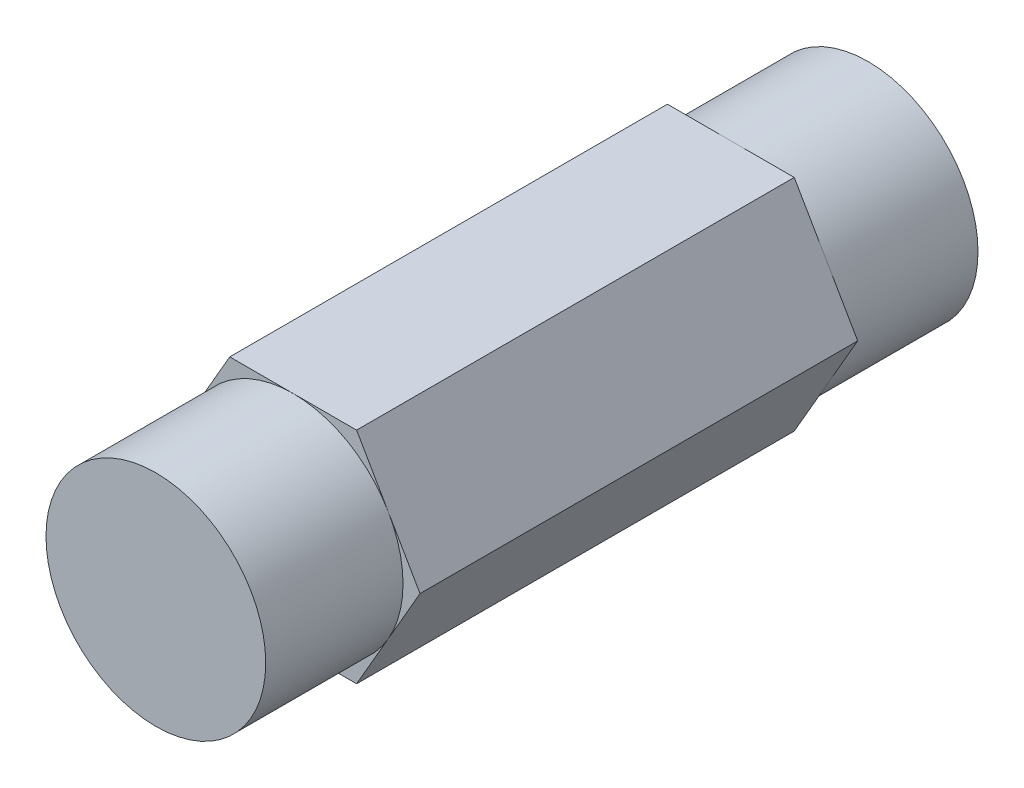
ISO-10303-21;
HEADER;
FILE_DESCRIPTION(('STEP AP214'),'2;1');
FILE_NAME('part.step','',(''),(''),'','','');
FILE_SCHEMA(('AUTOMOTIVE_DESIGN { 1 0 10303 214 1 1 1 1 }'));
ENDSEC;
DATA;
#1=APPLICATION_CONTEXT('core data for automotive mechanical design processes');
#2=APPLICATION_PROTOCOL_DEFINITION('international standard','automotive_design',2000,#1);
#3=PRODUCT_CONTEXT('',#1,'mechanical');
#4=PRODUCT('Part','Part','',(#3));
#5=PRODUCT_RELATED_PRODUCT_CATEGORY('part','',(#4));
#6=PRODUCT_DEFINITION_FORMATION('','',#4);
#7=PRODUCT_DEFINITION_CONTEXT('part definition',#1,'design');
#8=PRODUCT_DEFINITION('design','',#6,#7);
#9=PRODUCT_DEFINITION_SHAPE('','',#8);
#10=(LENGTH_UNIT() NAMED_UNIT(*) SI_UNIT(.MILLI.,.METRE.));
#11=(NAMED_UNIT(*) PLANE_ANGLE_UNIT() SI_UNIT($,.RADIAN.));
#12=(NAMED_UNIT(*) SI_UNIT($,.STERADIAN.) SOLID_ANGLE_UNIT());
#13=UNCERTAINTY_MEASURE_WITH_UNIT(LENGTH_MEASURE(1.E-05),#10,'distance_accuracy_value','');
#14=(GEOMETRIC_REPRESENTATION_CONTEXT(3) GLOBAL_UNCERTAINTY_ASSIGNED_CONTEXT((#13)) GLOBAL_UNIT_ASSIGNED_CONTEXT((#10,
#11,#12)) REPRESENTATION_CONTEXT('',''));
#15=CARTESIAN_POINT('',(0.,0.,0.));
#16=DIRECTION('',(0.,0.,1.));
#17=DIRECTION('',(1.,0.,0.));
#18=AXIS2_PLACEMENT_3D('',#15,#16,#17);
#19=CARTESIAN_POINT('',(0.,0.,33.2359));
#20=DIRECTION('',(0.,0.,1.));
#21=DIRECTION('',(1.,0.,0.));
#22=AXIS2_PLACEMENT_3D('',#19,#20,#21);
#23=PLANE('',#22);
#24=CARTESIAN_POINT('',(0.,0.,33.2359));
#25=DIRECTION('',(0.,0.,1.));
#26=DIRECTION('',(1.,0.,0.));
#27=AXIS2_PLACEMENT_3D('',#24,#25,#26);
#28=CIRCLE('',#27,6.35);
#29=CARTESIAN_POINT('',(5.49926131403118,3.175,33.2359));
#30=VERTEX_POINT('',#29);
#31=CARTESIAN_POINT('',(0.,6.35,33.2359));
#32=VERTEX_POINT('',#31);
#33=EDGE_CURVE('E45',#30,#32,#28,.T.);
#34=ORIENTED_EDGE('',*,*,#33,.F.);
#35=DIRECTION('',(-0.5,0.866025403784438,0.));
#36=VECTOR('',#35,1.);
#37=CARTESIAN_POINT('',(7.33234841870825,0.,33.2359));
#38=LINE('',#37,#36);
#39=CARTESIAN_POINT('',(3.66617420935412,6.35,33.2359));
#40=VERTEX_POINT('',#39);
#41=EDGE_CURVE('E138',#30,#40,#38,.T.);
#42=ORIENTED_EDGE('',*,*,#41,.T.);
#43=DIRECTION('',(-1.,0.,0.));
#44=VECTOR('',#43,1.);
#45=CARTESIAN_POINT('',(3.66617420935412,6.35,33.2359));
#46=LINE('',#45,#44);
#47=EDGE_CURVE('E151',#40,#32,#46,.T.);
#48=ORIENTED_EDGE('',*,*,#47,.T.);
#49=EDGE_LOOP('',(#34,#42,#48));
#50=FACE_BOUND('',#49,.T.);
#51=ADVANCED_FACE('F34',(#50),#23,.T.);
#52=CARTESIAN_POINT('',(-5.49926131403119,3.175,33.2359));
#53=VERTEX_POINT('',#52);
#54=EDGE_CURVE('E11',#32,#53,#28,.T.);
#55=ORIENTED_EDGE('',*,*,#54,.F.);
#56=CARTESIAN_POINT('',(-3.66617420935412,6.35,33.2359));
#57=VERTEX_POINT('',#56);
#58=EDGE_CURVE('E137',#32,#57,#46,.T.);
#59=ORIENTED_EDGE('',*,*,#58,.T.);
#60=DIRECTION('',(-0.5,-0.866025403784439,0.));
#61=VECTOR('',#60,1.);
#62=CARTESIAN_POINT('',(-3.66617420935412,6.35,33.2359));
#63=LINE('',#62,#61);
#64=EDGE_CURVE('E164',#57,#53,#63,.T.);
#65=ORIENTED_EDGE('',*,*,#64,.T.);
#66=EDGE_LOOP('',(#55,#59,#65));
#67=FACE_BOUND('',#66,.T.);
#68=ADVANCED_FACE('F264',(#67),#23,.T.);
#69=CARTESIAN_POINT('',(-5.49926131403118,-3.175,33.2359));
#70=VERTEX_POINT('',#69);
#71=EDGE_CURVE('E43',#53,#70,#28,.T.);
#72=ORIENTED_EDGE('',*,*,#71,.F.);
#73=CARTESIAN_POINT('',(-7.33234841870825,0.,33.2359));
#74=VERTEX_POINT('',#73);
#75=EDGE_CURVE('E163',#53,#74,#63,.T.);
#76=ORIENTED_EDGE('',*,*,#75,.T.);
#77=DIRECTION('',(0.5,-0.866025403784439,0.));
#78=VECTOR('',#77,1.);
#79=CARTESIAN_POINT('',(-7.33234841870825,0.,33.2359));
#80=LINE('',#79,#78);
#81=EDGE_CURVE('E168',#74,#70,#80,.T.);
#82=ORIENTED_EDGE('',*,*,#81,.T.);
#83=EDGE_LOOP('',(#72,#76,#82));
#84=FACE_BOUND('',#83,.T.);
#85=ADVANCED_FACE('F268',(#84),#23,.T.);
#86=CARTESIAN_POINT('',(0.,-6.35,33.2359));
#87=VERTEX_POINT('',#86);
#88=EDGE_CURVE('E60',#70,#87,#28,.T.);
#89=ORIENTED_EDGE('',*,*,#88,.F.);
#90=CARTESIAN_POINT('',(-3.66617420935412,-6.35,33.2359));
#91=VERTEX_POINT('',#90);
#92=EDGE_CURVE('E167',#70,#91,#80,.T.);
#93=ORIENTED_EDGE('',*,*,#92,.T.);
#94=DIRECTION('',(1.,0.,0.));
#95=VECTOR('',#94,1.);
#96=CARTESIAN_POINT('',(-3.66617420935412,-6.35,33.2359));
#97=LINE('',#96,#95);
#98=EDGE_CURVE('E172',#91,#87,#97,.T.);
#99=ORIENTED_EDGE('',*,*,#98,.T.);
#100=EDGE_LOOP('',(#89,#93,#99));
#101=FACE_BOUND('',#100,.T.);
#102=ADVANCED_FACE('F261',(#101),#23,.T.);
#103=CARTESIAN_POINT('',(5.49926131403119,-3.175,33.2359));
#104=VERTEX_POINT('',#103);
#105=EDGE_CURVE('E52',#87,#104,#28,.T.);
#106=ORIENTED_EDGE('',*,*,#105,.F.);
#107=CARTESIAN_POINT('',(3.66617420935413,-6.35,33.2359));
#108=VERTEX_POINT('',#107);
#109=EDGE_CURVE('E171',#87,#108,#97,.T.);
#110=ORIENTED_EDGE('',*,*,#109,.T.);
#111=DIRECTION('',(0.5,0.866025403784439,0.));
#112=VECTOR('',#111,1.);
#113=CARTESIAN_POINT('',(3.66617420935413,-6.35,33.2359));
#114=LINE('',#113,#112);
#115=EDGE_CURVE('E149',#108,#104,#114,.T.);
#116=ORIENTED_EDGE('',*,*,#115,.T.);
#117=EDGE_LOOP('',(#106,#110,#116));
#118=FACE_BOUND('',#117,.T.);
#119=ADVANCED_FACE('F255',(#118),#23,.T.);
#120=CARTESIAN_POINT('',(0.,0.,7.9375));
#121=DIRECTION('',(0.,0.,-1.));
#122=DIRECTION('',(-1.,0.,0.));
#123=AXIS2_PLACEMENT_3D('',#120,#121,#122);
#124=CYLINDRICAL_SURFACE('',#123,6.35);
#125=CARTESIAN_POINT('',(0.,0.,7.9375));
#126=DIRECTION('',(0.,0.,1.));
#127=DIRECTION('',(1.,0.,0.));
#128=AXIS2_PLACEMENT_3D('',#125,#126,#127);
#129=CIRCLE('',#128,6.35);
#130=CARTESIAN_POINT('',(5.49926131403118,3.175,7.9375));
#131=VERTEX_POINT('',#130);
#132=CARTESIAN_POINT('',(0.,6.35,7.9375));
#133=VERTEX_POINT('',#132);
#134=EDGE_CURVE('E155',#131,#133,#129,.T.);
#135=ORIENTED_EDGE('',*,*,#134,.F.);
#136=CARTESIAN_POINT('',(5.49926131403119,-3.175,7.9375));
#137=VERTEX_POINT('',#136);
#138=EDGE_CURVE('E158',#137,#131,#129,.T.);
#139=ORIENTED_EDGE('',*,*,#138,.F.);
#140=CARTESIAN_POINT('',(0.,-6.35,7.9375));
#141=VERTEX_POINT('',#140);
#142=EDGE_CURVE('E215',#141,#137,#129,.T.);
#143=ORIENTED_EDGE('',*,*,#142,.F.);
#144=CARTESIAN_POINT('',(-5.49926131403118,-3.175,7.9375));
#145=VERTEX_POINT('',#144);
#146=EDGE_CURVE('E221',#145,#141,#129,.T.);
#147=ORIENTED_EDGE('',*,*,#146,.F.);
#148=CARTESIAN_POINT('',(-5.49926131403119,3.175,7.9375));
#149=VERTEX_POINT('',#148);
#150=EDGE_CURVE('E226',#149,#145,#129,.T.);
#151=ORIENTED_EDGE('',*,*,#150,.F.);
#152=EDGE_CURVE('E157',#133,#149,#129,.T.);
#153=ORIENTED_EDGE('',*,*,#152,.F.);
#154=EDGE_LOOP('',(#135,#139,#143,#147,#151,#153));
#155=FACE_BOUND('',#154,.T.);
#156=CARTESIAN_POINT('',(0.,0.,0.));
#157=DIRECTION('',(0.,0.,1.));
#158=DIRECTION('',(1.,0.,0.));
#159=AXIS2_PLACEMENT_3D('',#156,#157,#158);
#160=CIRCLE('',#159,6.35);
#161=CARTESIAN_POINT('',(6.35,0.,0.));
#162=VERTEX_POINT('',#161);
#163=EDGE_CURVE('E38',#162,#162,#160,.T.);
#164=ORIENTED_EDGE('',*,*,#163,.T.);
#165=EDGE_LOOP('',(#164));
#166=FACE_BOUND('',#165,.T.);
#167=ADVANCED_FACE('F36',(#155,#166),#124,.T.);
#168=CARTESIAN_POINT('',(0.,0.,0.));
#169=DIRECTION('',(0.,0.,1.));
#170=DIRECTION('',(1.,0.,0.));
#171=AXIS2_PLACEMENT_3D('',#168,#169,#170);
#172=PLANE('',#171);
#173=ORIENTED_EDGE('',*,*,#163,.F.);
#174=EDGE_LOOP('',(#173));
#175=FACE_BOUND('',#174,.T.);
#176=ADVANCED_FACE('F254',(#175),#172,.F.);
#177=CARTESIAN_POINT('',(0.,0.,7.9375));
#178=DIRECTION('',(0.,0.,1.));
#179=DIRECTION('',(1.,0.,0.));
#180=AXIS2_PLACEMENT_3D('',#177,#178,#179);
#181=PLANE('',#180);
#182=DIRECTION('',(-0.5,0.866025403784438,0.));
#183=VECTOR('',#182,1.);
#184=CARTESIAN_POINT('',(7.33234841870825,0.,7.9375));
#185=LINE('',#184,#183);
#186=CARTESIAN_POINT('',(3.66617420935412,6.35,7.9375));
#187=VERTEX_POINT('',#186);
#188=EDGE_CURVE('E178',#131,#187,#185,.T.);
#189=ORIENTED_EDGE('',*,*,#188,.F.);
#190=ORIENTED_EDGE('',*,*,#134,.T.);
#191=DIRECTION('',(-1.,0.,0.));
#192=VECTOR('',#191,1.);
#193=CARTESIAN_POINT('',(3.66617420935412,6.35,7.9375));
#194=LINE('',#193,#192);
#195=EDGE_CURVE('E183',#187,#133,#194,.T.);
#196=ORIENTED_EDGE('',*,*,#195,.F.);
#197=EDGE_LOOP('',(#189,#190,#196));
#198=FACE_BOUND('',#197,.T.);
#199=ADVANCED_FACE('F252',(#198),#181,.F.);
#200=CARTESIAN_POINT('',(-3.66617420935412,6.35,7.9375));
#201=VERTEX_POINT('',#200);
#202=EDGE_CURVE('E182',#133,#201,#194,.T.);
#203=ORIENTED_EDGE('',*,*,#202,.F.);
#204=ORIENTED_EDGE('',*,*,#152,.T.);
#205=DIRECTION('',(-0.5,-0.866025403784439,0.));
#206=VECTOR('',#205,1.);
#207=CARTESIAN_POINT('',(-3.66617420935412,6.35,7.9375));
#208=LINE('',#207,#206);
#209=EDGE_CURVE('E187',#201,#149,#208,.T.);
#210=ORIENTED_EDGE('',*,*,#209,.F.);
#211=EDGE_LOOP('',(#203,#204,#210));
#212=FACE_BOUND('',#211,.T.);
#213=ADVANCED_FACE('F238',(#212),#181,.F.);
#214=CARTESIAN_POINT('',(-7.33234841870825,0.,7.9375));
#215=VERTEX_POINT('',#214);
#216=EDGE_CURVE('E186',#149,#215,#208,.T.);
#217=ORIENTED_EDGE('',*,*,#216,.F.);
#218=ORIENTED_EDGE('',*,*,#150,.T.);
#219=DIRECTION('',(0.5,-0.866025403784439,0.));
#220=VECTOR('',#219,1.);
#221=CARTESIAN_POINT('',(-7.33234841870825,0.,7.9375));
#222=LINE('',#221,#220);
#223=EDGE_CURVE('E191',#215,#145,#222,.T.);
#224=ORIENTED_EDGE('',*,*,#223,.F.);
#225=EDGE_LOOP('',(#217,#218,#224));
#226=FACE_BOUND('',#225,.T.);
#227=ADVANCED_FACE('F240',(#226),#181,.F.);
#228=CARTESIAN_POINT('',(-3.66617420935412,-6.35,7.9375));
#229=VERTEX_POINT('',#228);
#230=EDGE_CURVE('E190',#145,#229,#222,.T.);
#231=ORIENTED_EDGE('',*,*,#230,.F.);
#232=ORIENTED_EDGE('',*,*,#146,.T.);
#233=DIRECTION('',(1.,0.,0.));
#234=VECTOR('',#233,1.);
#235=CARTESIAN_POINT('',(-3.66617420935412,-6.35,7.9375));
#236=LINE('',#235,#234);
#237=EDGE_CURVE('E195',#229,#141,#236,.T.);
#238=ORIENTED_EDGE('',*,*,#237,.F.);
#239=EDGE_LOOP('',(#231,#232,#238));
#240=FACE_BOUND('',#239,.T.);
#241=ADVANCED_FACE('F307',(#240),#181,.F.);
#242=CARTESIAN_POINT('',(3.66617420935413,-6.35,7.9375));
#243=VERTEX_POINT('',#242);
#244=EDGE_CURVE('E194',#141,#243,#236,.T.);
#245=ORIENTED_EDGE('',*,*,#244,.F.);
#246=ORIENTED_EDGE('',*,*,#142,.T.);
#247=DIRECTION('',(0.5,0.866025403784439,0.));
#248=VECTOR('',#247,1.);
#249=CARTESIAN_POINT('',(3.66617420935413,-6.35,7.9375));
#250=LINE('',#249,#248);
#251=EDGE_CURVE('E175',#243,#137,#250,.T.);
#252=ORIENTED_EDGE('',*,*,#251,.F.);
#253=EDGE_LOOP('',(#245,#246,#252));
#254=FACE_BOUND('',#253,.T.);
#255=ADVANCED_FACE('F302',(#254),#181,.F.);
#256=CARTESIAN_POINT('',(7.33234841870825,0.,7.9375));
#257=VERTEX_POINT('',#256);
#258=EDGE_CURVE('E179',#137,#257,#250,.T.);
#259=ORIENTED_EDGE('',*,*,#258,.F.);
#260=ORIENTED_EDGE('',*,*,#138,.T.);
#261=EDGE_CURVE('E180',#257,#131,#185,.T.);
#262=ORIENTED_EDGE('',*,*,#261,.F.);
#263=EDGE_LOOP('',(#259,#260,#262));
#264=FACE_BOUND('',#263,.T.);
#265=ADVANCED_FACE('F297',(#264),#181,.F.);
#266=CARTESIAN_POINT('',(3.66617420935413,-6.35,33.2359));
#267=DIRECTION('',(-0.866025403784439,0.5,0.));
#268=DIRECTION('',(-0.5,-0.866025403784439,0.));
#269=AXIS2_PLACEMENT_3D('',#266,#267,#268);
#270=PLANE('',#269);
#271=ORIENTED_EDGE('',*,*,#251,.T.);
#272=ORIENTED_EDGE('',*,*,#258,.T.);
#273=DIRECTION('',(0.,0.,-1.));
#274=VECTOR('',#273,1.);
#275=CARTESIAN_POINT('',(7.33234841870825,0.,33.2359));
#276=LINE('',#275,#274);
#277=CARTESIAN_POINT('',(7.33234841870825,0.,33.2359));
#278=VERTEX_POINT('',#277);
#279=EDGE_CURVE('E210',#278,#257,#276,.T.);
#280=ORIENTED_EDGE('',*,*,#279,.F.);
#281=EDGE_CURVE('E133',#104,#278,#114,.T.);
#282=ORIENTED_EDGE('',*,*,#281,.F.);
#283=ORIENTED_EDGE('',*,*,#115,.F.);
#284=DIRECTION('',(0.,0.,-1.));
#285=VECTOR('',#284,1.);
#286=CARTESIAN_POINT('',(3.66617420935413,-6.35,33.2359));
#287=LINE('',#286,#285);
#288=EDGE_CURVE('E174',#108,#243,#287,.T.);
#289=ORIENTED_EDGE('',*,*,#288,.T.);
#290=EDGE_LOOP('',(#271,#272,#280,#282,#283,#289));
#291=FACE_BOUND('',#290,.T.);
#292=ADVANCED_FACE('F295',(#291),#270,.F.);
#293=CARTESIAN_POINT('',(7.33234841870825,0.,33.2359));
#294=DIRECTION('',(-0.866025403784438,-0.5,0.));
#295=DIRECTION('',(0.5,-0.866025403784438,0.));
#296=AXIS2_PLACEMENT_3D('',#293,#294,#295);
#297=PLANE('',#296);
#298=ORIENTED_EDGE('',*,*,#261,.T.);
#299=ORIENTED_EDGE('',*,*,#188,.T.);
#300=DIRECTION('',(0.,0.,-1.));
#301=VECTOR('',#300,1.);
#302=CARTESIAN_POINT('',(3.66617420935412,6.35,33.2359));
#303=LINE('',#302,#301);
#304=EDGE_CURVE('E145',#40,#187,#303,.T.);
#305=ORIENTED_EDGE('',*,*,#304,.F.);
#306=ORIENTED_EDGE('',*,*,#41,.F.);
#307=EDGE_CURVE('E127',#278,#30,#38,.T.);
#308=ORIENTED_EDGE('',*,*,#307,.F.);
#309=ORIENTED_EDGE('',*,*,#279,.T.);
#310=EDGE_LOOP('',(#298,#299,#305,#306,#308,#309));
#311=FACE_BOUND('',#310,.T.);
#312=ADVANCED_FACE('F143',(#311),#297,.F.);
#313=CARTESIAN_POINT('',(3.66617420935412,6.35,33.2359));
#314=DIRECTION('',(0.,-1.,0.));
#315=DIRECTION('',(1.,0.,0.));
#316=AXIS2_PLACEMENT_3D('',#313,#314,#315);
#317=PLANE('',#316);
#318=ORIENTED_EDGE('',*,*,#195,.T.);
#319=ORIENTED_EDGE('',*,*,#202,.T.);
#320=DIRECTION('',(0.,0.,-1.));
#321=VECTOR('',#320,1.);
#322=CARTESIAN_POINT('',(-3.66617420935412,6.35,33.2359));
#323=LINE('',#322,#321);
#324=EDGE_CURVE('E206',#57,#201,#323,.T.);
#325=ORIENTED_EDGE('',*,*,#324,.F.);
#326=ORIENTED_EDGE('',*,*,#58,.F.);
#327=ORIENTED_EDGE('',*,*,#47,.F.);
#328=ORIENTED_EDGE('',*,*,#304,.T.);
#329=EDGE_LOOP('',(#318,#319,#325,#326,#327,#328));
#330=FACE_BOUND('',#329,.T.);
#331=ADVANCED_FACE('F249',(#330),#317,.F.);
#332=CARTESIAN_POINT('',(-3.66617420935412,6.35,33.2359));
#333=DIRECTION('',(0.866025403784439,-0.5,0.));
#334=DIRECTION('',(0.5,0.866025403784439,0.));
#335=AXIS2_PLACEMENT_3D('',#332,#333,#334);
#336=PLANE('',#335);
#337=ORIENTED_EDGE('',*,*,#209,.T.);
#338=ORIENTED_EDGE('',*,*,#216,.T.);
#339=DIRECTION('',(0.,0.,-1.));
#340=VECTOR('',#339,1.);
#341=CARTESIAN_POINT('',(-7.33234841870825,0.,33.2359));
#342=LINE('',#341,#340);
#343=EDGE_CURVE('E203',#74,#215,#342,.T.);
#344=ORIENTED_EDGE('',*,*,#343,.F.);
#345=ORIENTED_EDGE('',*,*,#75,.F.);
#346=ORIENTED_EDGE('',*,*,#64,.F.);
#347=ORIENTED_EDGE('',*,*,#324,.T.);
#348=EDGE_LOOP('',(#337,#338,#344,#345,#346,#347));
#349=FACE_BOUND('',#348,.T.);
#350=ADVANCED_FACE('F243',(#349),#336,.F.);
#351=CARTESIAN_POINT('',(-7.33234841870825,0.,33.2359));
#352=DIRECTION('',(0.866025403784439,0.5,0.));
#353=DIRECTION('',(-0.5,0.866025403784439,0.));
#354=AXIS2_PLACEMENT_3D('',#351,#352,#353);
#355=PLANE('',#354);
#356=ORIENTED_EDGE('',*,*,#223,.T.);
#357=ORIENTED_EDGE('',*,*,#230,.T.);
#358=DIRECTION('',(0.,0.,-1.));
#359=VECTOR('',#358,1.);
#360=CARTESIAN_POINT('',(-3.66617420935412,-6.35,33.2359));
#361=LINE('',#360,#359);
#362=EDGE_CURVE('E200',#91,#229,#361,.T.);
#363=ORIENTED_EDGE('',*,*,#362,.F.);
#364=ORIENTED_EDGE('',*,*,#92,.F.);
#365=ORIENTED_EDGE('',*,*,#81,.F.);
#366=ORIENTED_EDGE('',*,*,#343,.T.);
#367=EDGE_LOOP('',(#356,#357,#363,#364,#365,#366));
#368=FACE_BOUND('',#367,.T.);
#369=ADVANCED_FACE('F280',(#368),#355,.F.);
#370=CARTESIAN_POINT('',(-3.66617420935412,-6.35,33.2359));
#371=DIRECTION('',(0.,1.,0.));
#372=DIRECTION('',(-1.,0.,0.));
#373=AXIS2_PLACEMENT_3D('',#370,#371,#372);
#374=PLANE('',#373);
#375=ORIENTED_EDGE('',*,*,#237,.T.);
#376=ORIENTED_EDGE('',*,*,#244,.T.);
#377=ORIENTED_EDGE('',*,*,#288,.F.);
#378=ORIENTED_EDGE('',*,*,#109,.F.);
#379=ORIENTED_EDGE('',*,*,#98,.F.);
#380=ORIENTED_EDGE('',*,*,#362,.T.);
#381=EDGE_LOOP('',(#375,#376,#377,#378,#379,#380));
#382=FACE_BOUND('',#381,.T.);
#383=ADVANCED_FACE('F273',(#382),#374,.F.);
#384=EDGE_CURVE('E131',#104,#30,#28,.T.);
#385=ORIENTED_EDGE('',*,*,#384,.F.);
#386=ORIENTED_EDGE('',*,*,#281,.T.);
#387=ORIENTED_EDGE('',*,*,#307,.T.);
#388=EDGE_LOOP('',(#385,#386,#387));
#389=FACE_BOUND('',#388,.T.);
#390=ADVANCED_FACE('F129',(#389),#23,.T.);
#391=CARTESIAN_POINT('',(0.,0.,41.1734));
#392=DIRECTION('',(0.,0.,-1.));
#393=DIRECTION('',(-1.,0.,0.));
#394=AXIS2_PLACEMENT_3D('',#391,#392,#393);
#395=CYLINDRICAL_SURFACE('',#394,6.35);
#396=CARTESIAN_POINT('',(0.,0.,41.1734));
#397=DIRECTION('',(0.,0.,1.));
#398=DIRECTION('',(1.,0.,0.));
#399=AXIS2_PLACEMENT_3D('',#396,#397,#398);
#400=CIRCLE('',#399,6.35);
#401=CARTESIAN_POINT('',(6.35,0.,41.1734));
#402=VERTEX_POINT('',#401);
#403=EDGE_CURVE('E153',#402,#402,#400,.T.);
#404=ORIENTED_EDGE('',*,*,#403,.F.);
#405=EDGE_LOOP('',(#404));
#406=FACE_BOUND('',#405,.T.);
#407=ORIENTED_EDGE('',*,*,#33,.T.);
#408=ORIENTED_EDGE('',*,*,#54,.T.);
#409=ORIENTED_EDGE('',*,*,#71,.T.);
#410=ORIENTED_EDGE('',*,*,#88,.T.);
#411=ORIENTED_EDGE('',*,*,#105,.T.);
#412=ORIENTED_EDGE('',*,*,#384,.T.);
#413=EDGE_LOOP('',(#407,#408,#409,#410,#411,#412));
#414=FACE_BOUND('',#413,.T.);
#415=ADVANCED_FACE('F154',(#406,#414),#395,.T.);
#416=CARTESIAN_POINT('',(0.,0.,41.1734));
#417=DIRECTION('',(0.,0.,1.));
#418=DIRECTION('',(1.,0.,0.));
#419=AXIS2_PLACEMENT_3D('',#416,#417,#418);
#420=PLANE('',#419);
#421=ORIENTED_EDGE('',*,*,#403,.T.);
#422=EDGE_LOOP('',(#421));
#423=FACE_BOUND('',#422,.T.);
#424=ADVANCED_FACE('F278',(#423),#420,.T.);
#425=CLOSED_SHELL('',(#51,#68,#85,#102,#119,#167,#176,#199,#213,#227,#241,#255,#265,#292,#312,
#331,#350,#369,#383,#390,#415,#424));
#426=MANIFOLD_SOLID_BREP('B2',#425);
#427=ADVANCED_BREP_SHAPE_REPRESENTATION('',(#18,#426),#14);
#428=SHAPE_DEFINITION_REPRESENTATION(#9,#427);
ENDSEC;
END-ISO-10303-21;
